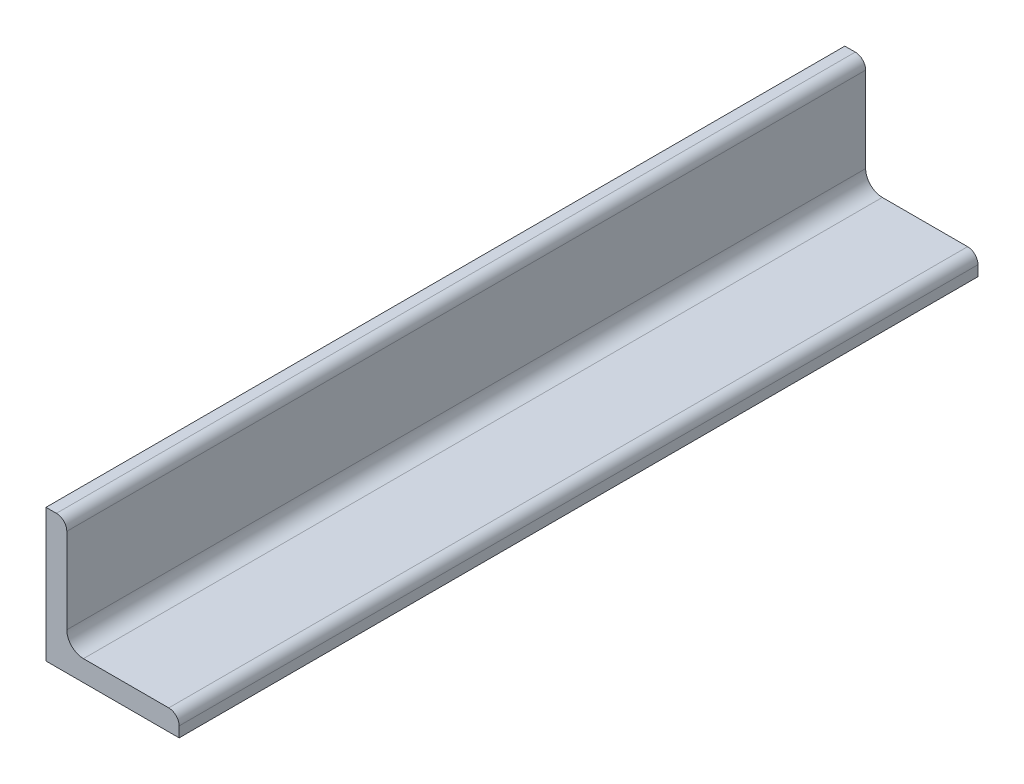
ISO-10303-21;
HEADER;
FILE_DESCRIPTION(('STEP AP214'),'2;1');
FILE_NAME('part.step','',(''),(''),'','','');
FILE_SCHEMA(('AUTOMOTIVE_DESIGN { 1 0 10303 214 1 1 1 1 }'));
ENDSEC;
DATA;
#1=APPLICATION_CONTEXT('core data for automotive mechanical design processes');
#2=APPLICATION_PROTOCOL_DEFINITION('international standard','automotive_design',2000,#1);
#3=PRODUCT_CONTEXT('',#1,'mechanical');
#4=PRODUCT('Part','Part','',(#3));
#5=PRODUCT_RELATED_PRODUCT_CATEGORY('part','',(#4));
#6=PRODUCT_DEFINITION_FORMATION('','',#4);
#7=PRODUCT_DEFINITION_CONTEXT('part definition',#1,'design');
#8=PRODUCT_DEFINITION('design','',#6,#7);
#9=PRODUCT_DEFINITION_SHAPE('','',#8);
#10=(LENGTH_UNIT() NAMED_UNIT(*) SI_UNIT(.MILLI.,.METRE.));
#11=(NAMED_UNIT(*) PLANE_ANGLE_UNIT() SI_UNIT($,.RADIAN.));
#12=(NAMED_UNIT(*) SI_UNIT($,.STERADIAN.) SOLID_ANGLE_UNIT());
#13=UNCERTAINTY_MEASURE_WITH_UNIT(LENGTH_MEASURE(1.E-05),#10,'distance_accuracy_value','');
#14=(GEOMETRIC_REPRESENTATION_CONTEXT(3) GLOBAL_UNCERTAINTY_ASSIGNED_CONTEXT((#13)) GLOBAL_UNIT_ASSIGNED_CONTEXT((#10,
#11,#12)) REPRESENTATION_CONTEXT('',''));
#15=CARTESIAN_POINT('',(0.,0.,0.));
#16=DIRECTION('',(0.,0.,1.));
#17=DIRECTION('',(1.,0.,0.));
#18=AXIS2_PLACEMENT_3D('',#15,#16,#17);
#19=CARTESIAN_POINT('',(0.116507760447575,51.418609434565,304.8));
#20=DIRECTION('',(1.,0.,0.));
#21=DIRECTION('',(0.,0.,-1.));
#22=AXIS2_PLACEMENT_3D('',#19,#20,#21);
#23=PLANE('',#22);
#24=DIRECTION('',(0.,-1.,0.));
#25=VECTOR('',#24,1.);
#26=CARTESIAN_POINT('',(0.116507760447575,51.418609434565,0.));
#27=LINE('',#26,#25);
#28=CARTESIAN_POINT('',(0.116507760447575,51.418609434565,0.));
#29=VERTEX_POINT('',#28);
#30=CARTESIAN_POINT('',(0.116507760447575,0.618609434565042,0.));
#31=VERTEX_POINT('',#30);
#32=EDGE_CURVE('E135',#29,#31,#27,.T.);
#33=ORIENTED_EDGE('',*,*,#32,.T.);
#34=DIRECTION('',(0.,0.,-1.));
#35=VECTOR('',#34,1.);
#36=CARTESIAN_POINT('',(0.116507760447575,0.618609434565042,304.8));
#37=LINE('',#36,#35);
#38=CARTESIAN_POINT('',(0.116507760447575,0.618609434565042,304.8));
#39=VERTEX_POINT('',#38);
#40=EDGE_CURVE('E11',#39,#31,#37,.T.);
#41=ORIENTED_EDGE('',*,*,#40,.F.);
#42=DIRECTION('',(0.,-1.,0.));
#43=VECTOR('',#42,1.);
#44=CARTESIAN_POINT('',(0.116507760447575,51.418609434565,304.8));
#45=LINE('',#44,#43);
#46=CARTESIAN_POINT('',(0.116507760447575,51.418609434565,304.8));
#47=VERTEX_POINT('',#46);
#48=EDGE_CURVE('E151',#47,#39,#45,.T.);
#49=ORIENTED_EDGE('',*,*,#48,.F.);
#50=DIRECTION('',(0.,0.,-1.));
#51=VECTOR('',#50,1.);
#52=CARTESIAN_POINT('',(0.116507760447575,51.418609434565,304.8));
#53=LINE('',#52,#51);
#54=EDGE_CURVE('E131',#47,#29,#53,.T.);
#55=ORIENTED_EDGE('',*,*,#54,.T.);
#56=EDGE_LOOP('',(#33,#41,#49,#55));
#57=FACE_BOUND('',#56,.T.);
#58=ADVANCED_FACE('F33',(#57),#23,.F.);
#59=CARTESIAN_POINT('',(0.116507760447575,0.618609434565042,304.8));
#60=DIRECTION('',(0.,1.,0.));
#61=DIRECTION('',(0.,0.,1.));
#62=AXIS2_PLACEMENT_3D('',#59,#60,#61);
#63=PLANE('',#62);
#64=DIRECTION('',(1.,0.,0.));
#65=VECTOR('',#64,1.);
#66=CARTESIAN_POINT('',(0.116507760447575,0.618609434565042,0.));
#67=LINE('',#66,#65);
#68=CARTESIAN_POINT('',(50.9165077604476,0.618609434565042,0.));
#69=VERTEX_POINT('',#68);
#70=EDGE_CURVE('E138',#31,#69,#67,.T.);
#71=ORIENTED_EDGE('',*,*,#70,.T.);
#72=DIRECTION('',(0.,0.,-1.));
#73=VECTOR('',#72,1.);
#74=CARTESIAN_POINT('',(50.9165077604476,0.618609434565042,304.8));
#75=LINE('',#74,#73);
#76=CARTESIAN_POINT('',(50.9165077604476,0.618609434565042,304.8));
#77=VERTEX_POINT('',#76);
#78=EDGE_CURVE('E41',#77,#69,#75,.T.);
#79=ORIENTED_EDGE('',*,*,#78,.F.);
#80=DIRECTION('',(1.,0.,0.));
#81=VECTOR('',#80,1.);
#82=CARTESIAN_POINT('',(0.116507760447575,0.618609434565042,304.8));
#83=LINE('',#82,#81);
#84=EDGE_CURVE('E95',#39,#77,#83,.T.);
#85=ORIENTED_EDGE('',*,*,#84,.F.);
#86=ORIENTED_EDGE('',*,*,#40,.T.);
#87=EDGE_LOOP('',(#71,#79,#85,#86));
#88=FACE_BOUND('',#87,.T.);
#89=ADVANCED_FACE('F194',(#88),#63,.F.);
#90=CARTESIAN_POINT('',(50.9165077604476,0.618609434565042,304.8));
#91=DIRECTION('',(-1.,0.,0.));
#92=DIRECTION('',(0.,0.,1.));
#93=AXIS2_PLACEMENT_3D('',#90,#91,#92);
#94=PLANE('',#93);
#95=DIRECTION('',(0.,1.,0.));
#96=VECTOR('',#95,1.);
#97=CARTESIAN_POINT('',(50.9165077604476,0.618609434565042,0.));
#98=LINE('',#97,#96);
#99=CARTESIAN_POINT('',(50.9165077604476,4.58735943456504,0.));
#100=VERTEX_POINT('',#99);
#101=EDGE_CURVE('E140',#69,#100,#98,.T.);
#102=ORIENTED_EDGE('',*,*,#101,.T.);
#103=DIRECTION('',(0.,0.,-1.));
#104=VECTOR('',#103,1.);
#105=CARTESIAN_POINT('',(50.9165077604476,4.58735943456504,304.8));
#106=LINE('',#105,#104);
#107=CARTESIAN_POINT('',(50.9165077604476,4.58735943456504,304.8));
#108=VERTEX_POINT('',#107);
#109=EDGE_CURVE('E161',#108,#100,#106,.T.);
#110=ORIENTED_EDGE('',*,*,#109,.F.);
#111=DIRECTION('',(0.,1.,0.));
#112=VECTOR('',#111,1.);
#113=CARTESIAN_POINT('',(50.9165077604476,0.618609434565042,304.8));
#114=LINE('',#113,#112);
#115=EDGE_CURVE('E169',#77,#108,#114,.T.);
#116=ORIENTED_EDGE('',*,*,#115,.F.);
#117=ORIENTED_EDGE('',*,*,#78,.T.);
#118=EDGE_LOOP('',(#102,#110,#116,#117));
#119=FACE_BOUND('',#118,.T.);
#120=ADVANCED_FACE('F167',(#119),#94,.F.);
#121=CARTESIAN_POINT('',(46.9477577604476,4.58735943456504,304.8));
#122=DIRECTION('',(0.,0.,-1.));
#123=DIRECTION('',(-1.,0.,0.));
#124=AXIS2_PLACEMENT_3D('',#121,#122,#123);
#125=CYLINDRICAL_SURFACE('',#124,3.96875);
#126=CARTESIAN_POINT('',(46.9477577604476,4.58735943456504,0.));
#127=DIRECTION('',(0.,0.,1.));
#128=DIRECTION('',(1.,0.,0.));
#129=AXIS2_PLACEMENT_3D('',#126,#127,#128);
#130=CIRCLE('',#129,3.96875);
#131=CARTESIAN_POINT('',(46.9477577604476,8.55610943456505,0.));
#132=VERTEX_POINT('',#131);
#133=EDGE_CURVE('E142',#100,#132,#130,.T.);
#134=ORIENTED_EDGE('',*,*,#133,.T.);
#135=DIRECTION('',(0.,0.,-1.));
#136=VECTOR('',#135,1.);
#137=CARTESIAN_POINT('',(46.9477577604476,8.55610943456505,304.8));
#138=LINE('',#137,#136);
#139=CARTESIAN_POINT('',(46.9477577604476,8.55610943456505,304.8));
#140=VERTEX_POINT('',#139);
#141=EDGE_CURVE('E158',#140,#132,#138,.T.);
#142=ORIENTED_EDGE('',*,*,#141,.F.);
#143=CARTESIAN_POINT('',(46.9477577604476,4.58735943456504,304.8));
#144=DIRECTION('',(0.,0.,1.));
#145=DIRECTION('',(1.,0.,0.));
#146=AXIS2_PLACEMENT_3D('',#143,#144,#145);
#147=CIRCLE('',#146,3.96875);
#148=EDGE_CURVE('E185',#108,#140,#147,.T.);
#149=ORIENTED_EDGE('',*,*,#148,.F.);
#150=ORIENTED_EDGE('',*,*,#109,.T.);
#151=EDGE_LOOP('',(#134,#142,#149,#150));
#152=FACE_BOUND('',#151,.T.);
#153=ADVANCED_FACE('F178',(#152),#125,.T.);
#154=CARTESIAN_POINT('',(46.9477577604476,8.55610943456504,304.8));
#155=DIRECTION('',(0.,-1.,0.));
#156=DIRECTION('',(0.,0.,-1.));
#157=AXIS2_PLACEMENT_3D('',#154,#155,#156);
#158=PLANE('',#157);
#159=DIRECTION('',(-1.,0.,0.));
#160=VECTOR('',#159,1.);
#161=CARTESIAN_POINT('',(46.9477577604476,8.55610943456504,0.));
#162=LINE('',#161,#160);
#163=CARTESIAN_POINT('',(14.4040077604476,8.55610943456504,0.));
#164=VERTEX_POINT('',#163);
#165=EDGE_CURVE('E144',#132,#164,#162,.T.);
#166=ORIENTED_EDGE('',*,*,#165,.T.);
#167=DIRECTION('',(0.,0.,-1.));
#168=VECTOR('',#167,1.);
#169=CARTESIAN_POINT('',(14.4040077604476,8.55610943456504,304.8));
#170=LINE('',#169,#168);
#171=CARTESIAN_POINT('',(14.4040077604476,8.55610943456504,304.8));
#172=VERTEX_POINT('',#171);
#173=EDGE_CURVE('E155',#172,#164,#170,.T.);
#174=ORIENTED_EDGE('',*,*,#173,.F.);
#175=DIRECTION('',(-1.,0.,0.));
#176=VECTOR('',#175,1.);
#177=CARTESIAN_POINT('',(46.9477577604476,8.55610943456504,304.8));
#178=LINE('',#177,#176);
#179=EDGE_CURVE('E184',#140,#172,#178,.T.);
#180=ORIENTED_EDGE('',*,*,#179,.F.);
#181=ORIENTED_EDGE('',*,*,#141,.T.);
#182=EDGE_LOOP('',(#166,#174,#180,#181));
#183=FACE_BOUND('',#182,.T.);
#184=ADVANCED_FACE('F182',(#183),#158,.F.);
#185=CARTESIAN_POINT('',(14.4040077604476,14.906109434565,304.8));
#186=DIRECTION('',(0.,0.,-1.));
#187=DIRECTION('',(-1.,0.,0.));
#188=AXIS2_PLACEMENT_3D('',#185,#186,#187);
#189=CYLINDRICAL_SURFACE('',#188,6.34999999999999);
#190=CARTESIAN_POINT('',(14.4040077604476,14.906109434565,0.));
#191=DIRECTION('',(0.,0.,-1.));
#192=DIRECTION('',(1.,0.,0.));
#193=AXIS2_PLACEMENT_3D('',#190,#191,#192);
#194=CIRCLE('',#193,6.34999999999999);
#195=CARTESIAN_POINT('',(8.05400776044758,14.906109434565,0.));
#196=VERTEX_POINT('',#195);
#197=EDGE_CURVE('E146',#164,#196,#194,.T.);
#198=ORIENTED_EDGE('',*,*,#197,.T.);
#199=DIRECTION('',(0.,0.,-1.));
#200=VECTOR('',#199,1.);
#201=CARTESIAN_POINT('',(8.05400776044758,14.906109434565,304.8));
#202=LINE('',#201,#200);
#203=CARTESIAN_POINT('',(8.05400776044758,14.906109434565,304.8));
#204=VERTEX_POINT('',#203);
#205=EDGE_CURVE('E126',#204,#196,#202,.T.);
#206=ORIENTED_EDGE('',*,*,#205,.F.);
#207=CARTESIAN_POINT('',(14.4040077604476,14.906109434565,304.8));
#208=DIRECTION('',(0.,0.,-1.));
#209=DIRECTION('',(1.,0.,0.));
#210=AXIS2_PLACEMENT_3D('',#207,#208,#209);
#211=CIRCLE('',#210,6.34999999999999);
#212=EDGE_CURVE('E117',#172,#204,#211,.T.);
#213=ORIENTED_EDGE('',*,*,#212,.F.);
#214=ORIENTED_EDGE('',*,*,#173,.T.);
#215=EDGE_LOOP('',(#198,#206,#213,#214));
#216=FACE_BOUND('',#215,.T.);
#217=ADVANCED_FACE('F206',(#216),#189,.F.);
#218=CARTESIAN_POINT('',(8.05400776044758,14.906109434565,304.8));
#219=DIRECTION('',(-1.,0.,0.));
#220=DIRECTION('',(0.,0.,1.));
#221=AXIS2_PLACEMENT_3D('',#218,#219,#220);
#222=PLANE('',#221);
#223=DIRECTION('',(0.,1.,0.));
#224=VECTOR('',#223,1.);
#225=CARTESIAN_POINT('',(8.05400776044758,14.906109434565,0.));
#226=LINE('',#225,#224);
#227=CARTESIAN_POINT('',(8.05400776044758,47.449859434565,0.));
#228=VERTEX_POINT('',#227);
#229=EDGE_CURVE('E125',#196,#228,#226,.T.);
#230=ORIENTED_EDGE('',*,*,#229,.T.);
#231=DIRECTION('',(0.,0.,-1.));
#232=VECTOR('',#231,1.);
#233=CARTESIAN_POINT('',(8.05400776044758,47.449859434565,304.8));
#234=LINE('',#233,#232);
#235=CARTESIAN_POINT('',(8.05400776044758,47.449859434565,304.8));
#236=VERTEX_POINT('',#235);
#237=EDGE_CURVE('E122',#236,#228,#234,.T.);
#238=ORIENTED_EDGE('',*,*,#237,.F.);
#239=DIRECTION('',(0.,1.,0.));
#240=VECTOR('',#239,1.);
#241=CARTESIAN_POINT('',(8.05400776044758,14.906109434565,304.8));
#242=LINE('',#241,#240);
#243=EDGE_CURVE('E111',#204,#236,#242,.T.);
#244=ORIENTED_EDGE('',*,*,#243,.F.);
#245=ORIENTED_EDGE('',*,*,#205,.T.);
#246=EDGE_LOOP('',(#230,#238,#244,#245));
#247=FACE_BOUND('',#246,.T.);
#248=ADVANCED_FACE('F123',(#247),#222,.F.);
#249=CARTESIAN_POINT('',(4.08525776044757,47.449859434565,304.8));
#250=DIRECTION('',(0.,0.,-1.));
#251=DIRECTION('',(-1.,0.,0.));
#252=AXIS2_PLACEMENT_3D('',#249,#250,#251);
#253=CYLINDRICAL_SURFACE('',#252,3.96875);
#254=CARTESIAN_POINT('',(4.08525776044757,47.449859434565,0.));
#255=DIRECTION('',(0.,0.,1.));
#256=DIRECTION('',(1.,0.,0.));
#257=AXIS2_PLACEMENT_3D('',#254,#255,#256);
#258=CIRCLE('',#257,3.96875);
#259=CARTESIAN_POINT('',(4.08525776044758,51.418609434565,0.));
#260=VERTEX_POINT('',#259);
#261=EDGE_CURVE('E81',#228,#260,#258,.T.);
#262=ORIENTED_EDGE('',*,*,#261,.T.);
#263=DIRECTION('',(0.,0.,-1.));
#264=VECTOR('',#263,1.);
#265=CARTESIAN_POINT('',(4.08525776044758,51.418609434565,304.8));
#266=LINE('',#265,#264);
#267=CARTESIAN_POINT('',(4.08525776044758,51.418609434565,304.8));
#268=VERTEX_POINT('',#267);
#269=EDGE_CURVE('E127',#268,#260,#266,.T.);
#270=ORIENTED_EDGE('',*,*,#269,.F.);
#271=CARTESIAN_POINT('',(4.08525776044757,47.449859434565,304.8));
#272=DIRECTION('',(0.,0.,1.));
#273=DIRECTION('',(1.,0.,0.));
#274=AXIS2_PLACEMENT_3D('',#271,#272,#273);
#275=CIRCLE('',#274,3.96875);
#276=EDGE_CURVE('E115',#236,#268,#275,.T.);
#277=ORIENTED_EDGE('',*,*,#276,.F.);
#278=ORIENTED_EDGE('',*,*,#237,.T.);
#279=EDGE_LOOP('',(#262,#270,#277,#278));
#280=FACE_BOUND('',#279,.T.);
#281=ADVANCED_FACE('F129',(#280),#253,.T.);
#282=CARTESIAN_POINT('',(4.08525776044758,51.418609434565,304.8));
#283=DIRECTION('',(0.,-1.,0.));
#284=DIRECTION('',(0.,0.,-1.));
#285=AXIS2_PLACEMENT_3D('',#282,#283,#284);
#286=PLANE('',#285);
#287=DIRECTION('',(-1.,0.,0.));
#288=VECTOR('',#287,1.);
#289=CARTESIAN_POINT('',(4.08525776044758,51.418609434565,0.));
#290=LINE('',#289,#288);
#291=EDGE_CURVE('E87',#260,#29,#290,.T.);
#292=ORIENTED_EDGE('',*,*,#291,.T.);
#293=ORIENTED_EDGE('',*,*,#54,.F.);
#294=DIRECTION('',(-1.,0.,0.));
#295=VECTOR('',#294,1.);
#296=CARTESIAN_POINT('',(4.08525776044758,51.418609434565,304.8));
#297=LINE('',#296,#295);
#298=EDGE_CURVE('E49',#268,#47,#297,.T.);
#299=ORIENTED_EDGE('',*,*,#298,.F.);
#300=ORIENTED_EDGE('',*,*,#269,.T.);
#301=EDGE_LOOP('',(#292,#293,#299,#300));
#302=FACE_BOUND('',#301,.T.);
#303=ADVANCED_FACE('F214',(#302),#286,.F.);
#304=CARTESIAN_POINT('',(46.9477577604476,4.58735943456504,304.8));
#305=DIRECTION('',(0.,0.,1.));
#306=DIRECTION('',(1.,0.,0.));
#307=AXIS2_PLACEMENT_3D('',#304,#305,#306);
#308=PLANE('',#307);
#309=ORIENTED_EDGE('',*,*,#48,.T.);
#310=ORIENTED_EDGE('',*,*,#84,.T.);
#311=ORIENTED_EDGE('',*,*,#115,.T.);
#312=ORIENTED_EDGE('',*,*,#148,.T.);
#313=ORIENTED_EDGE('',*,*,#179,.T.);
#314=ORIENTED_EDGE('',*,*,#212,.T.);
#315=ORIENTED_EDGE('',*,*,#243,.T.);
#316=ORIENTED_EDGE('',*,*,#276,.T.);
#317=ORIENTED_EDGE('',*,*,#298,.T.);
#318=EDGE_LOOP('',(#309,#310,#311,#312,#313,#314,#315,#316,#317));
#319=FACE_BOUND('',#318,.T.);
#320=ADVANCED_FACE('F113',(#319),#308,.T.);
#321=CARTESIAN_POINT('',(46.9477577604476,4.58735943456504,0.));
#322=DIRECTION('',(0.,0.,1.));
#323=DIRECTION('',(1.,0.,0.));
#324=AXIS2_PLACEMENT_3D('',#321,#322,#323);
#325=PLANE('',#324);
#326=ORIENTED_EDGE('',*,*,#32,.F.);
#327=ORIENTED_EDGE('',*,*,#291,.F.);
#328=ORIENTED_EDGE('',*,*,#261,.F.);
#329=ORIENTED_EDGE('',*,*,#229,.F.);
#330=ORIENTED_EDGE('',*,*,#197,.F.);
#331=ORIENTED_EDGE('',*,*,#165,.F.);
#332=ORIENTED_EDGE('',*,*,#133,.F.);
#333=ORIENTED_EDGE('',*,*,#101,.F.);
#334=ORIENTED_EDGE('',*,*,#70,.F.);
#335=EDGE_LOOP('',(#326,#327,#328,#329,#330,#331,#332,#333,#334));
#336=FACE_BOUND('',#335,.T.);
#337=ADVANCED_FACE('F173',(#336),#325,.F.);
#338=CLOSED_SHELL('',(#58,#89,#120,#153,#184,#217,#248,#281,#303,#320,#337));
#339=MANIFOLD_SOLID_BREP('B2',#338);
#340=ADVANCED_BREP_SHAPE_REPRESENTATION('',(#18,#339),#14);
#341=SHAPE_DEFINITION_REPRESENTATION(#9,#340);
ENDSEC;
END-ISO-10303-21;
